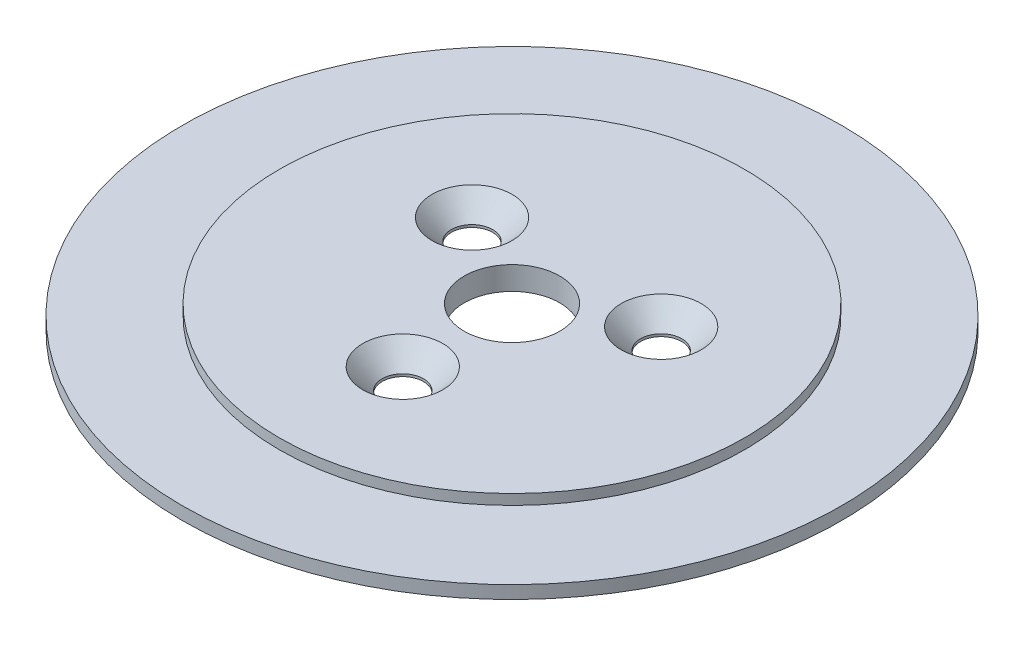
ISO-10303-21;
HEADER;
FILE_DESCRIPTION(('STEP AP214'),'2;1');
FILE_NAME('part.step','',(''),(''),'','','');
FILE_SCHEMA(('AUTOMOTIVE_DESIGN { 1 0 10303 214 1 1 1 1 }'));
ENDSEC;
DATA;
#1=APPLICATION_CONTEXT('core data for automotive mechanical design processes');
#2=APPLICATION_PROTOCOL_DEFINITION('international standard','automotive_design',2000,#1);
#3=PRODUCT_CONTEXT('',#1,'mechanical');
#4=PRODUCT('Part','Part','',(#3));
#5=PRODUCT_RELATED_PRODUCT_CATEGORY('part','',(#4));
#6=PRODUCT_DEFINITION_FORMATION('','',#4);
#7=PRODUCT_DEFINITION_CONTEXT('part definition',#1,'design');
#8=PRODUCT_DEFINITION('design','',#6,#7);
#9=PRODUCT_DEFINITION_SHAPE('','',#8);
#10=(LENGTH_UNIT() NAMED_UNIT(*) SI_UNIT(.MILLI.,.METRE.));
#11=(NAMED_UNIT(*) PLANE_ANGLE_UNIT() SI_UNIT($,.RADIAN.));
#12=(NAMED_UNIT(*) SI_UNIT($,.STERADIAN.) SOLID_ANGLE_UNIT());
#13=UNCERTAINTY_MEASURE_WITH_UNIT(LENGTH_MEASURE(1.E-05),#10,'distance_accuracy_value','');
#14=(GEOMETRIC_REPRESENTATION_CONTEXT(3) GLOBAL_UNCERTAINTY_ASSIGNED_CONTEXT((#13)) GLOBAL_UNIT_ASSIGNED_CONTEXT((#10,
#11,#12)) REPRESENTATION_CONTEXT('',''));
#15=CARTESIAN_POINT('',(0.,0.,0.));
#16=DIRECTION('',(0.,0.,1.));
#17=DIRECTION('',(1.,0.,0.));
#18=AXIS2_PLACEMENT_3D('',#15,#16,#17);
#19=CARTESIAN_POINT('',(0.,1.,0.));
#20=DIRECTION('',(0.,-1.,0.));
#21=DIRECTION('',(0.,0.,-1.));
#22=AXIS2_PLACEMENT_3D('',#19,#20,#21);
#23=CYLINDRICAL_SURFACE('',#22,25.5);
#24=CARTESIAN_POINT('',(0.,1.,0.));
#25=DIRECTION('',(0.,1.,0.));
#26=DIRECTION('',(0.,0.,1.));
#27=AXIS2_PLACEMENT_3D('',#24,#25,#26);
#28=CIRCLE('',#27,25.5);
#29=CARTESIAN_POINT('',(0.,1.,25.5));
#30=VERTEX_POINT('',#29);
#31=EDGE_CURVE('E10',#30,#30,#28,.T.);
#32=ORIENTED_EDGE('',*,*,#31,.F.);
#33=EDGE_LOOP('',(#32));
#34=FACE_BOUND('',#33,.T.);
#35=CARTESIAN_POINT('',(0.,0.,0.));
#36=DIRECTION('',(0.,1.,0.));
#37=DIRECTION('',(0.,0.,1.));
#38=AXIS2_PLACEMENT_3D('',#35,#36,#37);
#39=CIRCLE('',#38,25.5);
#40=CARTESIAN_POINT('',(0.,0.,25.5));
#41=VERTEX_POINT('',#40);
#42=EDGE_CURVE('E49',#41,#41,#39,.T.);
#43=ORIENTED_EDGE('',*,*,#42,.T.);
#44=EDGE_LOOP('',(#43));
#45=FACE_BOUND('',#44,.T.);
#46=ADVANCED_FACE('F37',(#34,#45),#23,.T.);
#47=CARTESIAN_POINT('',(0.,1.,0.));
#48=DIRECTION('',(0.,-1.,0.));
#49=DIRECTION('',(0.,0.,-1.));
#50=AXIS2_PLACEMENT_3D('',#47,#48,#49);
#51=CYLINDRICAL_SURFACE('',#50,3.7);
#52=CARTESIAN_POINT('',(0.,0.,0.));
#53=DIRECTION('',(0.,1.,0.));
#54=DIRECTION('',(0.,0.,1.));
#55=AXIS2_PLACEMENT_3D('',#52,#53,#54);
#56=CIRCLE('',#55,3.7);
#57=CARTESIAN_POINT('',(0.,0.,3.7));
#58=VERTEX_POINT('',#57);
#59=EDGE_CURVE('E44',#58,#58,#56,.T.);
#60=ORIENTED_EDGE('',*,*,#59,.F.);
#61=EDGE_LOOP('',(#60));
#62=FACE_BOUND('',#61,.T.);
#63=CARTESIAN_POINT('',(0.,1.8,0.));
#64=DIRECTION('',(0.,1.,0.));
#65=DIRECTION('',(0.,0.,1.));
#66=AXIS2_PLACEMENT_3D('',#63,#64,#65);
#67=CIRCLE('',#66,3.7);
#68=CARTESIAN_POINT('',(0.,1.8,3.7));
#69=VERTEX_POINT('',#68);
#70=EDGE_CURVE('E59',#69,#69,#67,.T.);
#71=ORIENTED_EDGE('',*,*,#70,.T.);
#72=EDGE_LOOP('',(#71));
#73=FACE_BOUND('',#72,.T.);
#74=ADVANCED_FACE('F107',(#62,#73),#51,.F.);
#75=CARTESIAN_POINT('',(0.,1.,0.));
#76=DIRECTION('',(0.,1.,0.));
#77=DIRECTION('',(0.,0.,1.));
#78=AXIS2_PLACEMENT_3D('',#75,#76,#77);
#79=PLANE('',#78);
#80=CARTESIAN_POINT('',(0.,1.,0.));
#81=DIRECTION('',(0.,1.,0.));
#82=DIRECTION('',(0.,0.,1.));
#83=AXIS2_PLACEMENT_3D('',#80,#81,#82);
#84=CIRCLE('',#83,18.);
#85=CARTESIAN_POINT('',(0.,1.,18.));
#86=VERTEX_POINT('',#85);
#87=EDGE_CURVE('E53',#86,#86,#84,.F.);
#88=ORIENTED_EDGE('',*,*,#87,.T.);
#89=EDGE_LOOP('',(#88));
#90=FACE_BOUND('',#89,.T.);
#91=ORIENTED_EDGE('',*,*,#31,.T.);
#92=EDGE_LOOP('',(#91));
#93=FACE_BOUND('',#92,.T.);
#94=ADVANCED_FACE('F88',(#90,#93),#79,.T.);
#95=CARTESIAN_POINT('',(0.,0.,0.));
#96=DIRECTION('',(0.,1.,0.));
#97=DIRECTION('',(0.,0.,1.));
#98=AXIS2_PLACEMENT_3D('',#95,#96,#97);
#99=PLANE('',#98);
#100=CARTESIAN_POINT('',(7.3179146619785,0.,-4.225));
#101=DIRECTION('',(0.,1.,0.));
#102=DIRECTION('',(0.,0.,1.));
#103=AXIS2_PLACEMENT_3D('',#100,#101,#102);
#104=CIRCLE('',#103,1.6);
#105=CARTESIAN_POINT('',(7.3179146619785,0.,-2.625));
#106=VERTEX_POINT('',#105);
#107=EDGE_CURVE('E40',#106,#106,#104,.T.);
#108=ORIENTED_EDGE('',*,*,#107,.T.);
#109=EDGE_LOOP('',(#108));
#110=FACE_BOUND('',#109,.T.);
#111=CARTESIAN_POINT('',(-7.31791466197851,0.,-4.225));
#112=DIRECTION('',(0.,1.,0.));
#113=DIRECTION('',(0.,0.,1.));
#114=AXIS2_PLACEMENT_3D('',#111,#112,#113);
#115=CIRCLE('',#114,1.6);
#116=CARTESIAN_POINT('',(-7.31791466197851,0.,-2.625));
#117=VERTEX_POINT('',#116);
#118=EDGE_CURVE('E61',#117,#117,#115,.T.);
#119=ORIENTED_EDGE('',*,*,#118,.T.);
#120=EDGE_LOOP('',(#119));
#121=FACE_BOUND('',#120,.T.);
#122=CARTESIAN_POINT('',(0.,0.,8.45));
#123=DIRECTION('',(0.,1.,0.));
#124=DIRECTION('',(0.,0.,1.));
#125=AXIS2_PLACEMENT_3D('',#122,#123,#124);
#126=CIRCLE('',#125,1.6);
#127=CARTESIAN_POINT('',(0.,0.,10.05));
#128=VERTEX_POINT('',#127);
#129=EDGE_CURVE('E57',#128,#128,#126,.T.);
#130=ORIENTED_EDGE('',*,*,#129,.T.);
#131=EDGE_LOOP('',(#130));
#132=FACE_BOUND('',#131,.T.);
#133=ORIENTED_EDGE('',*,*,#42,.F.);
#134=EDGE_LOOP('',(#133));
#135=FACE_BOUND('',#134,.T.);
#136=ORIENTED_EDGE('',*,*,#59,.T.);
#137=EDGE_LOOP('',(#136));
#138=FACE_BOUND('',#137,.T.);
#139=ADVANCED_FACE('F94',(#110,#121,#132,#135,#138),#99,.F.);
#140=CARTESIAN_POINT('',(0.,1.8,0.));
#141=DIRECTION('',(0.,-1.,0.));
#142=DIRECTION('',(0.,0.,-1.));
#143=AXIS2_PLACEMENT_3D('',#140,#141,#142);
#144=CYLINDRICAL_SURFACE('',#143,18.);
#145=ORIENTED_EDGE('',*,*,#87,.F.);
#146=EDGE_LOOP('',(#145));
#147=FACE_BOUND('',#146,.T.);
#148=CARTESIAN_POINT('',(0.,1.8,0.));
#149=DIRECTION('',(0.,1.,0.));
#150=DIRECTION('',(0.,0.,1.));
#151=AXIS2_PLACEMENT_3D('',#148,#149,#150);
#152=CIRCLE('',#151,18.);
#153=CARTESIAN_POINT('',(0.,1.8,18.));
#154=VERTEX_POINT('',#153);
#155=EDGE_CURVE('E81',#154,#154,#152,.T.);
#156=ORIENTED_EDGE('',*,*,#155,.F.);
#157=EDGE_LOOP('',(#156));
#158=FACE_BOUND('',#157,.T.);
#159=ADVANCED_FACE('F90',(#147,#158),#144,.T.);
#160=CARTESIAN_POINT('',(0.,1.8,0.));
#161=DIRECTION('',(0.,1.,0.));
#162=DIRECTION('',(0.,0.,1.));
#163=AXIS2_PLACEMENT_3D('',#160,#161,#162);
#164=PLANE('',#163);
#165=CARTESIAN_POINT('',(7.3179146619785,1.8,-4.225));
#166=DIRECTION('',(0.,1.,0.));
#167=DIRECTION('',(0.,0.,1.));
#168=AXIS2_PLACEMENT_3D('',#165,#166,#167);
#169=CIRCLE('',#168,3.1);
#170=CARTESIAN_POINT('',(7.3179146619785,1.8,-1.125));
#171=VERTEX_POINT('',#170);
#172=EDGE_CURVE('E208',#171,#171,#169,.T.);
#173=ORIENTED_EDGE('',*,*,#172,.F.);
#174=EDGE_LOOP('',(#173));
#175=FACE_BOUND('',#174,.T.);
#176=CARTESIAN_POINT('',(-7.31791466197851,1.8,-4.225));
#177=DIRECTION('',(0.,1.,0.));
#178=DIRECTION('',(0.,0.,1.));
#179=AXIS2_PLACEMENT_3D('',#176,#177,#178);
#180=CIRCLE('',#179,3.1);
#181=CARTESIAN_POINT('',(-7.31791466197851,1.8,-1.125));
#182=VERTEX_POINT('',#181);
#183=EDGE_CURVE('E70',#182,#182,#180,.T.);
#184=ORIENTED_EDGE('',*,*,#183,.F.);
#185=EDGE_LOOP('',(#184));
#186=FACE_BOUND('',#185,.T.);
#187=CARTESIAN_POINT('',(0.,1.8,8.45));
#188=DIRECTION('',(0.,1.,0.));
#189=DIRECTION('',(0.,0.,1.));
#190=AXIS2_PLACEMENT_3D('',#187,#188,#189);
#191=CIRCLE('',#190,3.1);
#192=CARTESIAN_POINT('',(0.,1.8,11.55));
#193=VERTEX_POINT('',#192);
#194=EDGE_CURVE('E63',#193,#193,#191,.T.);
#195=ORIENTED_EDGE('',*,*,#194,.F.);
#196=EDGE_LOOP('',(#195));
#197=FACE_BOUND('',#196,.T.);
#198=ORIENTED_EDGE('',*,*,#70,.F.);
#199=EDGE_LOOP('',(#198));
#200=FACE_BOUND('',#199,.T.);
#201=ORIENTED_EDGE('',*,*,#155,.T.);
#202=EDGE_LOOP('',(#201));
#203=FACE_BOUND('',#202,.T.);
#204=ADVANCED_FACE('F93',(#175,#186,#197,#200,#203),#164,.T.);
#205=CARTESIAN_POINT('',(0.,1.8,8.45));
#206=DIRECTION('',(0.,1.,0.));
#207=DIRECTION('',(0.,0.,1.));
#208=AXIS2_PLACEMENT_3D('',#205,#206,#207);
#209=CYLINDRICAL_SURFACE('',#208,1.6);
#210=CARTESIAN_POINT('',(0.,0.191446934962983,8.45));
#211=DIRECTION('',(0.,1.,0.));
#212=DIRECTION('',(0.,0.,1.));
#213=AXIS2_PLACEMENT_3D('',#210,#211,#212);
#214=CIRCLE('',#213,1.6);
#215=CARTESIAN_POINT('',(0.,0.191446934962983,10.05));
#216=VERTEX_POINT('',#215);
#217=EDGE_CURVE('E60',#216,#216,#214,.T.);
#218=ORIENTED_EDGE('',*,*,#217,.T.);
#219=EDGE_LOOP('',(#218));
#220=FACE_BOUND('',#219,.T.);
#221=ORIENTED_EDGE('',*,*,#129,.F.);
#222=EDGE_LOOP('',(#221));
#223=FACE_BOUND('',#222,.T.);
#224=ADVANCED_FACE('F100',(#220,#223),#209,.F.);
#225=CARTESIAN_POINT('',(0.,1.8,8.45));
#226=DIRECTION('',(0.,1.,0.));
#227=DIRECTION('',(0.,0.,1.));
#228=AXIS2_PLACEMENT_3D('',#225,#226,#227);
#229=CONICAL_SURFACE('',#228,3.1,0.750491578357564);
#230=ORIENTED_EDGE('',*,*,#217,.F.);
#231=EDGE_LOOP('',(#230));
#232=FACE_BOUND('',#231,.T.);
#233=ORIENTED_EDGE('',*,*,#194,.T.);
#234=EDGE_LOOP('',(#233));
#235=FACE_BOUND('',#234,.T.);
#236=ADVANCED_FACE('F149',(#232,#235),#229,.F.);
#237=CARTESIAN_POINT('',(-7.31791466197851,1.8,-4.225));
#238=DIRECTION('',(0.,1.,0.));
#239=DIRECTION('',(0.,0.,1.));
#240=AXIS2_PLACEMENT_3D('',#237,#238,#239);
#241=CYLINDRICAL_SURFACE('',#240,1.6);
#242=CARTESIAN_POINT('',(-7.31791466197851,0.191446934962983,-4.225));
#243=DIRECTION('',(0.,1.,0.));
#244=DIRECTION('',(0.,0.,1.));
#245=AXIS2_PLACEMENT_3D('',#242,#243,#244);
#246=CIRCLE('',#245,1.6);
#247=CARTESIAN_POINT('',(-7.31791466197851,0.191446934962983,-2.625));
#248=VERTEX_POINT('',#247);
#249=EDGE_CURVE('E64',#248,#248,#246,.T.);
#250=ORIENTED_EDGE('',*,*,#249,.T.);
#251=EDGE_LOOP('',(#250));
#252=FACE_BOUND('',#251,.T.);
#253=ORIENTED_EDGE('',*,*,#118,.F.);
#254=EDGE_LOOP('',(#253));
#255=FACE_BOUND('',#254,.T.);
#256=ADVANCED_FACE('F159',(#252,#255),#241,.F.);
#257=CARTESIAN_POINT('',(-7.31791466197851,1.8,-4.225));
#258=DIRECTION('',(0.,1.,0.));
#259=DIRECTION('',(0.,0.,1.));
#260=AXIS2_PLACEMENT_3D('',#257,#258,#259);
#261=CONICAL_SURFACE('',#260,3.1,0.750491578357564);
#262=ORIENTED_EDGE('',*,*,#249,.F.);
#263=EDGE_LOOP('',(#262));
#264=FACE_BOUND('',#263,.T.);
#265=ORIENTED_EDGE('',*,*,#183,.T.);
#266=EDGE_LOOP('',(#265));
#267=FACE_BOUND('',#266,.T.);
#268=ADVANCED_FACE('F169',(#264,#267),#261,.F.);
#269=CARTESIAN_POINT('',(7.3179146619785,1.8,-4.225));
#270=DIRECTION('',(0.,1.,0.));
#271=DIRECTION('',(0.,0.,1.));
#272=AXIS2_PLACEMENT_3D('',#269,#270,#271);
#273=CYLINDRICAL_SURFACE('',#272,1.6);
#274=CARTESIAN_POINT('',(7.3179146619785,0.191446934962983,-4.225));
#275=DIRECTION('',(0.,1.,0.));
#276=DIRECTION('',(0.,0.,1.));
#277=AXIS2_PLACEMENT_3D('',#274,#275,#276);
#278=CIRCLE('',#277,1.6);
#279=CARTESIAN_POINT('',(7.3179146619785,0.191446934962983,-2.625));
#280=VERTEX_POINT('',#279);
#281=EDGE_CURVE('E205',#280,#280,#278,.T.);
#282=ORIENTED_EDGE('',*,*,#281,.T.);
#283=EDGE_LOOP('',(#282));
#284=FACE_BOUND('',#283,.T.);
#285=ORIENTED_EDGE('',*,*,#107,.F.);
#286=EDGE_LOOP('',(#285));
#287=FACE_BOUND('',#286,.T.);
#288=ADVANCED_FACE('F178',(#284,#287),#273,.F.);
#289=CARTESIAN_POINT('',(7.3179146619785,1.8,-4.225));
#290=DIRECTION('',(0.,1.,0.));
#291=DIRECTION('',(0.,0.,1.));
#292=AXIS2_PLACEMENT_3D('',#289,#290,#291);
#293=CONICAL_SURFACE('',#292,3.1,0.750491578357564);
#294=ORIENTED_EDGE('',*,*,#281,.F.);
#295=EDGE_LOOP('',(#294));
#296=FACE_BOUND('',#295,.T.);
#297=ORIENTED_EDGE('',*,*,#172,.T.);
#298=EDGE_LOOP('',(#297));
#299=FACE_BOUND('',#298,.T.);
#300=ADVANCED_FACE('F188',(#296,#299),#293,.F.);
#301=CLOSED_SHELL('',(#46,#74,#94,#139,#159,#204,#224,#236,#256,#268,#288,#300));
#302=MANIFOLD_SOLID_BREP('B2',#301);
#303=ADVANCED_BREP_SHAPE_REPRESENTATION('',(#18,#302),#14);
#304=SHAPE_DEFINITION_REPRESENTATION(#9,#303);
ENDSEC;
END-ISO-10303-21;
